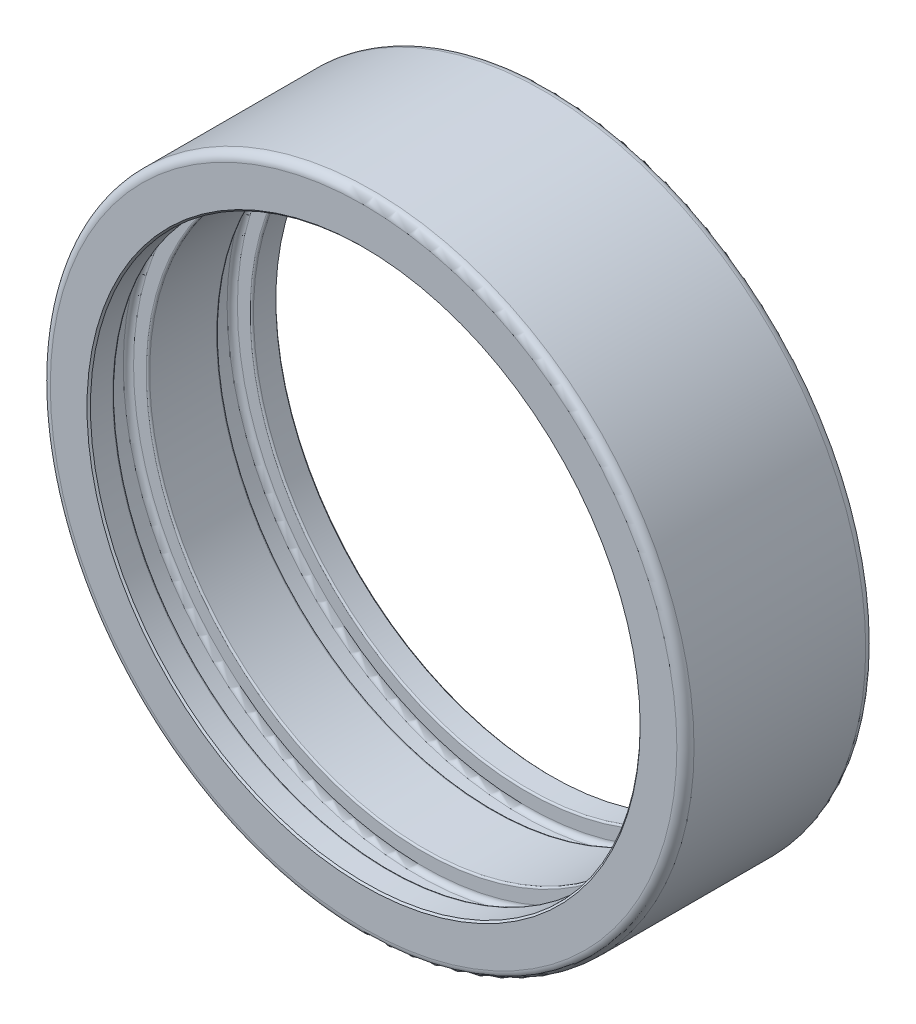
ISO-10303-21;
HEADER;
FILE_DESCRIPTION(('STEP AP214'),'2;1');
FILE_NAME('part.step','',(''),(''),'','','');
FILE_SCHEMA(('AUTOMOTIVE_DESIGN { 1 0 10303 214 1 1 1 1 }'));
ENDSEC;
DATA;
#1=APPLICATION_CONTEXT('core data for automotive mechanical design processes');
#2=APPLICATION_PROTOCOL_DEFINITION('international standard','automotive_design',2000,#1);
#3=PRODUCT_CONTEXT('',#1,'mechanical');
#4=PRODUCT('Part','Part','',(#3));
#5=PRODUCT_RELATED_PRODUCT_CATEGORY('part','',(#4));
#6=PRODUCT_DEFINITION_FORMATION('','',#4);
#7=PRODUCT_DEFINITION_CONTEXT('part definition',#1,'design');
#8=PRODUCT_DEFINITION('design','',#6,#7);
#9=PRODUCT_DEFINITION_SHAPE('','',#8);
#10=(LENGTH_UNIT() NAMED_UNIT(*) SI_UNIT(.MILLI.,.METRE.));
#11=(NAMED_UNIT(*) PLANE_ANGLE_UNIT() SI_UNIT($,.RADIAN.));
#12=(NAMED_UNIT(*) SI_UNIT($,.STERADIAN.) SOLID_ANGLE_UNIT());
#13=UNCERTAINTY_MEASURE_WITH_UNIT(LENGTH_MEASURE(1.E-05),#10,'distance_accuracy_value','');
#14=(GEOMETRIC_REPRESENTATION_CONTEXT(3) GLOBAL_UNCERTAINTY_ASSIGNED_CONTEXT((#13)) GLOBAL_UNIT_ASSIGNED_CONTEXT((#10,
#11,#12)) REPRESENTATION_CONTEXT('',''));
#15=CARTESIAN_POINT('',(0.,0.,0.));
#16=DIRECTION('',(0.,0.,1.));
#17=DIRECTION('',(1.,0.,0.));
#18=AXIS2_PLACEMENT_3D('',#15,#16,#17);
#19=CARTESIAN_POINT('',(0.,0.,22.));
#20=DIRECTION('',(0.,0.,-1.));
#21=DIRECTION('',(-1.,0.,0.));
#22=AXIS2_PLACEMENT_3D('',#19,#20,#21);
#23=CYLINDRICAL_SURFACE('',#22,32.025);
#24=CARTESIAN_POINT('',(0.,0.,0.200000000000013));
#25=DIRECTION('',(0.,0.,1.));
#26=DIRECTION('',(1.,0.,0.));
#27=AXIS2_PLACEMENT_3D('',#24,#25,#26);
#28=CIRCLE('',#27,32.025);
#29=CARTESIAN_POINT('',(32.025,0.,0.200000000000013));
#30=VERTEX_POINT('',#29);
#31=EDGE_CURVE('E44',#30,#30,#28,.F.);
#32=ORIENTED_EDGE('',*,*,#31,.T.);
#33=EDGE_LOOP('',(#32));
#34=FACE_BOUND('',#33,.T.);
#35=CARTESIAN_POINT('',(0.,0.,2.8));
#36=DIRECTION('',(0.,0.,1.));
#37=DIRECTION('',(1.,0.,0.));
#38=AXIS2_PLACEMENT_3D('',#35,#36,#37);
#39=CIRCLE('',#38,32.025);
#40=CARTESIAN_POINT('',(32.025,0.,2.8));
#41=VERTEX_POINT('',#40);
#42=EDGE_CURVE('E74',#41,#41,#39,.T.);
#43=ORIENTED_EDGE('',*,*,#42,.T.);
#44=EDGE_LOOP('',(#43));
#45=FACE_BOUND('',#44,.T.);
#46=ADVANCED_FACE('F33',(#34,#45),#23,.F.);
#47=CARTESIAN_POINT('',(0.,0.,7.1));
#48=DIRECTION('',(0.,0.,1.));
#49=DIRECTION('',(1.,0.,0.));
#50=AXIS2_PLACEMENT_3D('',#47,#48,#49);
#51=CIRCLE('',#50,32.025);
#52=CARTESIAN_POINT('',(32.025,0.,7.1));
#53=VERTEX_POINT('',#52);
#54=EDGE_CURVE('E62',#53,#53,#51,.F.);
#55=ORIENTED_EDGE('',*,*,#54,.T.);
#56=EDGE_LOOP('',(#55));
#57=FACE_BOUND('',#56,.T.);
#58=CARTESIAN_POINT('',(0.,0.,14.9));
#59=DIRECTION('',(0.,0.,1.));
#60=DIRECTION('',(1.,0.,0.));
#61=AXIS2_PLACEMENT_3D('',#58,#59,#60);
#62=CIRCLE('',#61,32.025);
#63=CARTESIAN_POINT('',(32.025,0.,14.9));
#64=VERTEX_POINT('',#63);
#65=EDGE_CURVE('E65',#64,#64,#62,.T.);
#66=ORIENTED_EDGE('',*,*,#65,.T.);
#67=EDGE_LOOP('',(#66));
#68=FACE_BOUND('',#67,.T.);
#69=ADVANCED_FACE('F132',(#57,#68),#23,.F.);
#70=CARTESIAN_POINT('',(0.,0.,22.));
#71=DIRECTION('',(0.,0.,1.));
#72=DIRECTION('',(1.,0.,0.));
#73=AXIS2_PLACEMENT_3D('',#70,#71,#72);
#74=PLANE('',#73);
#75=CARTESIAN_POINT('',(0.,0.,22.));
#76=DIRECTION('',(0.,0.,1.));
#77=DIRECTION('',(1.,0.,0.));
#78=AXIS2_PLACEMENT_3D('',#75,#76,#77);
#79=CIRCLE('',#78,32.225);
#80=CARTESIAN_POINT('',(32.225,0.,22.));
#81=VERTEX_POINT('',#80);
#82=EDGE_CURVE('E10',#81,#81,#79,.F.);
#83=ORIENTED_EDGE('',*,*,#82,.T.);
#84=EDGE_LOOP('',(#83));
#85=FACE_BOUND('',#84,.T.);
#86=CARTESIAN_POINT('',(0.,0.,22.));
#87=DIRECTION('',(0.,0.,1.));
#88=DIRECTION('',(1.,0.,0.));
#89=AXIS2_PLACEMENT_3D('',#86,#87,#88);
#90=CIRCLE('',#89,36.5);
#91=CARTESIAN_POINT('',(36.5,0.,22.));
#92=VERTEX_POINT('',#91);
#93=EDGE_CURVE('E77',#92,#92,#90,.T.);
#94=ORIENTED_EDGE('',*,*,#93,.T.);
#95=EDGE_LOOP('',(#94));
#96=FACE_BOUND('',#95,.T.);
#97=ADVANCED_FACE('F139',(#85,#96),#74,.T.);
#98=CARTESIAN_POINT('',(0.,0.,0.));
#99=DIRECTION('',(0.,0.,1.));
#100=DIRECTION('',(1.,0.,0.));
#101=AXIS2_PLACEMENT_3D('',#98,#99,#100);
#102=PLANE('',#101);
#103=CARTESIAN_POINT('',(0.,0.,0.));
#104=DIRECTION('',(0.,0.,1.));
#105=DIRECTION('',(1.,0.,0.));
#106=AXIS2_PLACEMENT_3D('',#103,#104,#105);
#107=CIRCLE('',#106,32.225);
#108=CARTESIAN_POINT('',(32.225,0.,0.));
#109=VERTEX_POINT('',#108);
#110=EDGE_CURVE('E48',#109,#109,#107,.T.);
#111=ORIENTED_EDGE('',*,*,#110,.T.);
#112=EDGE_LOOP('',(#111));
#113=FACE_BOUND('',#112,.T.);
#114=CARTESIAN_POINT('',(0.,0.,0.));
#115=DIRECTION('',(0.,0.,1.));
#116=DIRECTION('',(1.,0.,0.));
#117=AXIS2_PLACEMENT_3D('',#114,#115,#116);
#118=CIRCLE('',#117,36.5);
#119=CARTESIAN_POINT('',(36.5,0.,0.));
#120=VERTEX_POINT('',#119);
#121=EDGE_CURVE('E80',#120,#120,#118,.F.);
#122=ORIENTED_EDGE('',*,*,#121,.T.);
#123=EDGE_LOOP('',(#122));
#124=FACE_BOUND('',#123,.T.);
#125=ADVANCED_FACE('F154',(#113,#124),#102,.F.);
#126=CARTESIAN_POINT('',(0.,0.,22.));
#127=DIRECTION('',(0.,0.,-1.));
#128=DIRECTION('',(-1.,0.,0.));
#129=AXIS2_PLACEMENT_3D('',#126,#127,#128);
#130=CYLINDRICAL_SURFACE('',#129,37.5);
#131=CARTESIAN_POINT('',(0.,0.,1.));
#132=DIRECTION('',(0.,0.,1.));
#133=DIRECTION('',(1.,0.,0.));
#134=AXIS2_PLACEMENT_3D('',#131,#132,#133);
#135=CIRCLE('',#134,37.5);
#136=CARTESIAN_POINT('',(37.5,0.,1.));
#137=VERTEX_POINT('',#136);
#138=EDGE_CURVE('E83',#137,#137,#135,.T.);
#139=ORIENTED_EDGE('',*,*,#138,.T.);
#140=EDGE_LOOP('',(#139));
#141=FACE_BOUND('',#140,.T.);
#142=CARTESIAN_POINT('',(0.,0.,21.));
#143=DIRECTION('',(0.,0.,1.));
#144=DIRECTION('',(1.,0.,0.));
#145=AXIS2_PLACEMENT_3D('',#142,#143,#144);
#146=CIRCLE('',#145,37.5);
#147=CARTESIAN_POINT('',(37.5,0.,21.));
#148=VERTEX_POINT('',#147);
#149=EDGE_CURVE('E86',#148,#148,#146,.F.);
#150=ORIENTED_EDGE('',*,*,#149,.T.);
#151=EDGE_LOOP('',(#150));
#152=FACE_BOUND('',#151,.T.);
#153=ADVANCED_FACE('F146',(#141,#152),#130,.T.);
#154=CARTESIAN_POINT('',(0.,0.,21.8));
#155=DIRECTION('',(0.,0.,1.));
#156=DIRECTION('',(1.,0.,0.));
#157=AXIS2_PLACEMENT_3D('',#154,#155,#156);
#158=CIRCLE('',#157,32.025);
#159=CARTESIAN_POINT('',(32.025,0.,21.8));
#160=VERTEX_POINT('',#159);
#161=EDGE_CURVE('E40',#160,#160,#158,.T.);
#162=ORIENTED_EDGE('',*,*,#161,.T.);
#163=EDGE_LOOP('',(#162));
#164=FACE_BOUND('',#163,.T.);
#165=CARTESIAN_POINT('',(0.,0.,19.2));
#166=DIRECTION('',(0.,0.,1.));
#167=DIRECTION('',(1.,0.,0.));
#168=AXIS2_PLACEMENT_3D('',#165,#166,#167);
#169=CIRCLE('',#168,32.025);
#170=CARTESIAN_POINT('',(32.025,0.,19.2));
#171=VERTEX_POINT('',#170);
#172=EDGE_CURVE('E53',#171,#171,#169,.F.);
#173=ORIENTED_EDGE('',*,*,#172,.T.);
#174=EDGE_LOOP('',(#173));
#175=FACE_BOUND('',#174,.T.);
#176=ADVANCED_FACE('F135',(#164,#175),#23,.F.);
#177=CARTESIAN_POINT('',(0.,0.,1.));
#178=DIRECTION('',(0.,0.,1.));
#179=DIRECTION('',(1.,0.,0.));
#180=AXIS2_PLACEMENT_3D('',#177,#178,#179);
#181=TOROIDAL_SURFACE('',#180,36.5,1.);
#182=ORIENTED_EDGE('',*,*,#121,.F.);
#183=EDGE_LOOP('',(#182));
#184=FACE_BOUND('',#183,.T.);
#185=ORIENTED_EDGE('',*,*,#138,.F.);
#186=EDGE_LOOP('',(#185));
#187=FACE_BOUND('',#186,.T.);
#188=ADVANCED_FACE('F145',(#184,#187),#181,.T.);
#189=CARTESIAN_POINT('',(0.,0.,21.));
#190=DIRECTION('',(0.,0.,1.));
#191=DIRECTION('',(1.,0.,0.));
#192=AXIS2_PLACEMENT_3D('',#189,#190,#191);
#193=TOROIDAL_SURFACE('',#192,36.5,1.);
#194=ORIENTED_EDGE('',*,*,#149,.F.);
#195=EDGE_LOOP('',(#194));
#196=FACE_BOUND('',#195,.T.);
#197=ORIENTED_EDGE('',*,*,#93,.F.);
#198=EDGE_LOOP('',(#197));
#199=FACE_BOUND('',#198,.T.);
#200=ADVANCED_FACE('F151',(#196,#199),#193,.T.);
#201=CARTESIAN_POINT('',(0.,0.,18.4));
#202=DIRECTION('',(0.,0.,-1.));
#203=DIRECTION('',(-1.,0.,0.));
#204=AXIS2_PLACEMENT_3D('',#201,#202,#203);
#205=TOROIDAL_SURFACE('',#204,33.7,0.6);
#206=CARTESIAN_POINT('',(0.,0.,18.4));
#207=DIRECTION('',(0.,0.,-1.));
#208=DIRECTION('',(-1.,0.,0.));
#209=AXIS2_PLACEMENT_3D('',#206,#207,#208);
#210=CIRCLE('',#209,34.3);
#211=CARTESIAN_POINT('',(-34.3,0.,18.4));
#212=VERTEX_POINT('',#211);
#213=EDGE_CURVE('E89',#212,#212,#210,.T.);
#214=ORIENTED_EDGE('',*,*,#213,.T.);
#215=EDGE_LOOP('',(#214));
#216=FACE_BOUND('',#215,.T.);
#217=CARTESIAN_POINT('',(0.,0.,19.));
#218=DIRECTION('',(0.,0.,-1.));
#219=DIRECTION('',(-1.,0.,0.));
#220=AXIS2_PLACEMENT_3D('',#217,#218,#219);
#221=CIRCLE('',#220,33.7);
#222=CARTESIAN_POINT('',(-33.7,0.,19.));
#223=VERTEX_POINT('',#222);
#224=EDGE_CURVE('E98',#223,#223,#221,.T.);
#225=ORIENTED_EDGE('',*,*,#224,.F.);
#226=EDGE_LOOP('',(#225));
#227=FACE_BOUND('',#226,.T.);
#228=ADVANCED_FACE('F174',(#216,#227),#205,.F.);
#229=CARTESIAN_POINT('',(0.,0.,0.));
#230=DIRECTION('',(0.,0.,-1.));
#231=DIRECTION('',(-1.,0.,0.));
#232=AXIS2_PLACEMENT_3D('',#229,#230,#231);
#233=CYLINDRICAL_SURFACE('',#232,34.3);
#234=CARTESIAN_POINT('',(0.,0.,15.7));
#235=DIRECTION('',(0.,0.,-1.));
#236=DIRECTION('',(-1.,0.,0.));
#237=AXIS2_PLACEMENT_3D('',#234,#235,#236);
#238=CIRCLE('',#237,34.3);
#239=CARTESIAN_POINT('',(-34.3,0.,15.7));
#240=VERTEX_POINT('',#239);
#241=EDGE_CURVE('E92',#240,#240,#238,.T.);
#242=ORIENTED_EDGE('',*,*,#241,.T.);
#243=EDGE_LOOP('',(#242));
#244=FACE_BOUND('',#243,.T.);
#245=ORIENTED_EDGE('',*,*,#213,.F.);
#246=EDGE_LOOP('',(#245));
#247=FACE_BOUND('',#246,.T.);
#248=ADVANCED_FACE('F176',(#244,#247),#233,.F.);
#249=CARTESIAN_POINT('',(0.,0.,15.7));
#250=DIRECTION('',(0.,0.,-1.));
#251=DIRECTION('',(-1.,0.,0.));
#252=AXIS2_PLACEMENT_3D('',#249,#250,#251);
#253=TOROIDAL_SURFACE('',#252,33.7,0.600000000000002);
#254=ORIENTED_EDGE('',*,*,#241,.F.);
#255=EDGE_LOOP('',(#254));
#256=FACE_BOUND('',#255,.T.);
#257=CARTESIAN_POINT('',(0.,0.,15.1));
#258=DIRECTION('',(0.,0.,-1.));
#259=DIRECTION('',(-1.,0.,0.));
#260=AXIS2_PLACEMENT_3D('',#257,#258,#259);
#261=CIRCLE('',#260,33.7);
#262=CARTESIAN_POINT('',(-33.7,0.,15.1));
#263=VERTEX_POINT('',#262);
#264=EDGE_CURVE('E95',#263,#263,#261,.T.);
#265=ORIENTED_EDGE('',*,*,#264,.T.);
#266=EDGE_LOOP('',(#265));
#267=FACE_BOUND('',#266,.T.);
#268=ADVANCED_FACE('F182',(#256,#267),#253,.F.);
#269=CARTESIAN_POINT('',(0.,33.7,15.1));
#270=DIRECTION('',(0.,0.,1.));
#271=DIRECTION('',(1.,0.,0.));
#272=AXIS2_PLACEMENT_3D('',#269,#270,#271);
#273=PLANE('',#272);
#274=CARTESIAN_POINT('',(0.,0.,15.1));
#275=DIRECTION('',(0.,0.,1.));
#276=DIRECTION('',(1.,0.,0.));
#277=AXIS2_PLACEMENT_3D('',#274,#275,#276);
#278=CIRCLE('',#277,32.225);
#279=CARTESIAN_POINT('',(32.225,0.,15.1));
#280=VERTEX_POINT('',#279);
#281=EDGE_CURVE('E59',#280,#280,#278,.F.);
#282=ORIENTED_EDGE('',*,*,#281,.T.);
#283=EDGE_LOOP('',(#282));
#284=FACE_BOUND('',#283,.T.);
#285=ORIENTED_EDGE('',*,*,#264,.F.);
#286=EDGE_LOOP('',(#285));
#287=FACE_BOUND('',#286,.T.);
#288=ADVANCED_FACE('F170',(#284,#287),#273,.T.);
#289=CARTESIAN_POINT('',(0.,33.7,19.));
#290=DIRECTION('',(0.,0.,1.));
#291=DIRECTION('',(1.,0.,0.));
#292=AXIS2_PLACEMENT_3D('',#289,#290,#291);
#293=PLANE('',#292);
#294=CARTESIAN_POINT('',(0.,0.,19.));
#295=DIRECTION('',(0.,0.,1.));
#296=DIRECTION('',(1.,0.,0.));
#297=AXIS2_PLACEMENT_3D('',#294,#295,#296);
#298=CIRCLE('',#297,32.225);
#299=CARTESIAN_POINT('',(32.225,0.,19.));
#300=VERTEX_POINT('',#299);
#301=EDGE_CURVE('E56',#300,#300,#298,.T.);
#302=ORIENTED_EDGE('',*,*,#301,.T.);
#303=EDGE_LOOP('',(#302));
#304=FACE_BOUND('',#303,.T.);
#305=ORIENTED_EDGE('',*,*,#224,.T.);
#306=EDGE_LOOP('',(#305));
#307=FACE_BOUND('',#306,.T.);
#308=ADVANCED_FACE('F129',(#304,#307),#293,.F.);
#309=CARTESIAN_POINT('',(0.,0.,6.29999999999999));
#310=DIRECTION('',(0.,0.,-1.));
#311=DIRECTION('',(-1.,0.,0.));
#312=AXIS2_PLACEMENT_3D('',#309,#310,#311);
#313=TOROIDAL_SURFACE('',#312,33.7,0.600000000000002);
#314=CARTESIAN_POINT('',(0.,0.,6.29999999999999));
#315=DIRECTION('',(0.,0.,-1.));
#316=DIRECTION('',(-1.,0.,0.));
#317=AXIS2_PLACEMENT_3D('',#314,#315,#316);
#318=CIRCLE('',#317,34.3);
#319=CARTESIAN_POINT('',(-34.3,0.,6.29999999999999));
#320=VERTEX_POINT('',#319);
#321=EDGE_CURVE('E110',#320,#320,#318,.T.);
#322=ORIENTED_EDGE('',*,*,#321,.T.);
#323=EDGE_LOOP('',(#322));
#324=FACE_BOUND('',#323,.T.);
#325=CARTESIAN_POINT('',(0.,0.,6.89999999999999));
#326=DIRECTION('',(0.,0.,-1.));
#327=DIRECTION('',(-1.,0.,0.));
#328=AXIS2_PLACEMENT_3D('',#325,#326,#327);
#329=CIRCLE('',#328,33.7);
#330=CARTESIAN_POINT('',(-33.7,0.,6.89999999999999));
#331=VERTEX_POINT('',#330);
#332=EDGE_CURVE('E101',#331,#331,#329,.T.);
#333=ORIENTED_EDGE('',*,*,#332,.F.);
#334=EDGE_LOOP('',(#333));
#335=FACE_BOUND('',#334,.T.);
#336=ADVANCED_FACE('F114',(#324,#335),#313,.F.);
#337=CARTESIAN_POINT('',(0.,0.,0.));
#338=DIRECTION('',(0.,0.,-1.));
#339=DIRECTION('',(-1.,0.,0.));
#340=AXIS2_PLACEMENT_3D('',#337,#338,#339);
#341=CYLINDRICAL_SURFACE('',#340,34.3);
#342=CARTESIAN_POINT('',(0.,0.,3.6));
#343=DIRECTION('',(0.,0.,-1.));
#344=DIRECTION('',(-1.,0.,0.));
#345=AXIS2_PLACEMENT_3D('',#342,#343,#344);
#346=CIRCLE('',#345,34.3);
#347=CARTESIAN_POINT('',(-34.3,0.,3.6));
#348=VERTEX_POINT('',#347);
#349=EDGE_CURVE('E107',#348,#348,#346,.T.);
#350=ORIENTED_EDGE('',*,*,#349,.T.);
#351=EDGE_LOOP('',(#350));
#352=FACE_BOUND('',#351,.T.);
#353=ORIENTED_EDGE('',*,*,#321,.F.);
#354=EDGE_LOOP('',(#353));
#355=FACE_BOUND('',#354,.T.);
#356=ADVANCED_FACE('F117',(#352,#355),#341,.F.);
#357=CARTESIAN_POINT('',(0.,0.,3.6));
#358=DIRECTION('',(0.,0.,-1.));
#359=DIRECTION('',(-1.,0.,0.));
#360=AXIS2_PLACEMENT_3D('',#357,#358,#359);
#361=TOROIDAL_SURFACE('',#360,33.7,0.600000000000001);
#362=ORIENTED_EDGE('',*,*,#349,.F.);
#363=EDGE_LOOP('',(#362));
#364=FACE_BOUND('',#363,.T.);
#365=CARTESIAN_POINT('',(0.,0.,3.));
#366=DIRECTION('',(0.,0.,-1.));
#367=DIRECTION('',(-1.,0.,0.));
#368=AXIS2_PLACEMENT_3D('',#365,#366,#367);
#369=CIRCLE('',#368,33.7);
#370=CARTESIAN_POINT('',(-33.7,0.,3.));
#371=VERTEX_POINT('',#370);
#372=EDGE_CURVE('E104',#371,#371,#369,.T.);
#373=ORIENTED_EDGE('',*,*,#372,.T.);
#374=EDGE_LOOP('',(#373));
#375=FACE_BOUND('',#374,.T.);
#376=ADVANCED_FACE('F119',(#364,#375),#361,.F.);
#377=CARTESIAN_POINT('',(0.,33.7,3.));
#378=DIRECTION('',(0.,0.,1.));
#379=DIRECTION('',(1.,0.,0.));
#380=AXIS2_PLACEMENT_3D('',#377,#378,#379);
#381=PLANE('',#380);
#382=CARTESIAN_POINT('',(0.,0.,3.));
#383=DIRECTION('',(0.,0.,1.));
#384=DIRECTION('',(1.,0.,0.));
#385=AXIS2_PLACEMENT_3D('',#382,#383,#384);
#386=CIRCLE('',#385,32.225);
#387=CARTESIAN_POINT('',(32.225,0.,3.));
#388=VERTEX_POINT('',#387);
#389=EDGE_CURVE('E71',#388,#388,#386,.F.);
#390=ORIENTED_EDGE('',*,*,#389,.T.);
#391=EDGE_LOOP('',(#390));
#392=FACE_BOUND('',#391,.T.);
#393=ORIENTED_EDGE('',*,*,#372,.F.);
#394=EDGE_LOOP('',(#393));
#395=FACE_BOUND('',#394,.T.);
#396=ADVANCED_FACE('F126',(#392,#395),#381,.T.);
#397=CARTESIAN_POINT('',(0.,33.7,6.9));
#398=DIRECTION('',(0.,0.,1.));
#399=DIRECTION('',(1.,0.,0.));
#400=AXIS2_PLACEMENT_3D('',#397,#398,#399);
#401=PLANE('',#400);
#402=CARTESIAN_POINT('',(0.,0.,6.9));
#403=DIRECTION('',(0.,0.,1.));
#404=DIRECTION('',(1.,0.,0.));
#405=AXIS2_PLACEMENT_3D('',#402,#403,#404);
#406=CIRCLE('',#405,32.225);
#407=CARTESIAN_POINT('',(32.225,0.,6.9));
#408=VERTEX_POINT('',#407);
#409=EDGE_CURVE('E68',#408,#408,#406,.T.);
#410=ORIENTED_EDGE('',*,*,#409,.T.);
#411=EDGE_LOOP('',(#410));
#412=FACE_BOUND('',#411,.T.);
#413=ORIENTED_EDGE('',*,*,#332,.T.);
#414=EDGE_LOOP('',(#413));
#415=FACE_BOUND('',#414,.T.);
#416=ADVANCED_FACE('F194',(#412,#415),#401,.F.);
#417=CARTESIAN_POINT('',(0.,0.,2.8));
#418=DIRECTION('',(0.,0.,1.));
#419=DIRECTION('',(1.,0.,0.));
#420=AXIS2_PLACEMENT_3D('',#417,#418,#419);
#421=TOROIDAL_SURFACE('',#420,32.225,0.2);
#422=ORIENTED_EDGE('',*,*,#389,.F.);
#423=EDGE_LOOP('',(#422));
#424=FACE_BOUND('',#423,.T.);
#425=ORIENTED_EDGE('',*,*,#42,.F.);
#426=EDGE_LOOP('',(#425));
#427=FACE_BOUND('',#426,.T.);
#428=ADVANCED_FACE('F197',(#424,#427),#421,.T.);
#429=CARTESIAN_POINT('',(0.,0.,7.1));
#430=DIRECTION('',(0.,0.,1.));
#431=DIRECTION('',(1.,0.,0.));
#432=AXIS2_PLACEMENT_3D('',#429,#430,#431);
#433=TOROIDAL_SURFACE('',#432,32.225,0.2);
#434=ORIENTED_EDGE('',*,*,#54,.F.);
#435=EDGE_LOOP('',(#434));
#436=FACE_BOUND('',#435,.T.);
#437=ORIENTED_EDGE('',*,*,#409,.F.);
#438=EDGE_LOOP('',(#437));
#439=FACE_BOUND('',#438,.T.);
#440=ADVANCED_FACE('F210',(#436,#439),#433,.T.);
#441=CARTESIAN_POINT('',(0.,0.,14.9));
#442=DIRECTION('',(0.,0.,1.));
#443=DIRECTION('',(1.,0.,0.));
#444=AXIS2_PLACEMENT_3D('',#441,#442,#443);
#445=TOROIDAL_SURFACE('',#444,32.225,0.2);
#446=ORIENTED_EDGE('',*,*,#281,.F.);
#447=EDGE_LOOP('',(#446));
#448=FACE_BOUND('',#447,.T.);
#449=ORIENTED_EDGE('',*,*,#65,.F.);
#450=EDGE_LOOP('',(#449));
#451=FACE_BOUND('',#450,.T.);
#452=ADVANCED_FACE('F164',(#448,#451),#445,.T.);
#453=CARTESIAN_POINT('',(0.,0.,19.2));
#454=DIRECTION('',(0.,0.,1.));
#455=DIRECTION('',(1.,0.,0.));
#456=AXIS2_PLACEMENT_3D('',#453,#454,#455);
#457=TOROIDAL_SURFACE('',#456,32.225,0.2);
#458=ORIENTED_EDGE('',*,*,#172,.F.);
#459=EDGE_LOOP('',(#458));
#460=FACE_BOUND('',#459,.T.);
#461=ORIENTED_EDGE('',*,*,#301,.F.);
#462=EDGE_LOOP('',(#461));
#463=FACE_BOUND('',#462,.T.);
#464=ADVANCED_FACE('F160',(#460,#463),#457,.T.);
#465=CARTESIAN_POINT('',(0.,0.,0.));
#466=DIRECTION('',(0.,0.,-1.));
#467=DIRECTION('',(-1.,0.,0.));
#468=AXIS2_PLACEMENT_3D('',#465,#466,#467);
#469=CONICAL_SURFACE('',#468,32.225,0.785398163397448);
#470=ORIENTED_EDGE('',*,*,#31,.F.);
#471=EDGE_LOOP('',(#470));
#472=FACE_BOUND('',#471,.T.);
#473=ORIENTED_EDGE('',*,*,#110,.F.);
#474=EDGE_LOOP('',(#473));
#475=FACE_BOUND('',#474,.T.);
#476=ADVANCED_FACE('F163',(#472,#475),#469,.F.);
#477=CARTESIAN_POINT('',(0.,0.,21.8));
#478=DIRECTION('',(0.,0.,1.));
#479=DIRECTION('',(1.,0.,0.));
#480=AXIS2_PLACEMENT_3D('',#477,#478,#479);
#481=CONICAL_SURFACE('',#480,32.025,0.785398163397448);
#482=ORIENTED_EDGE('',*,*,#82,.F.);
#483=EDGE_LOOP('',(#482));
#484=FACE_BOUND('',#483,.T.);
#485=ORIENTED_EDGE('',*,*,#161,.F.);
#486=EDGE_LOOP('',(#485));
#487=FACE_BOUND('',#486,.T.);
#488=ADVANCED_FACE('F35',(#484,#487),#481,.F.);
#489=CLOSED_SHELL('',(#46,#69,#97,#125,#153,#176,#188,#200,#228,#248,#268,#288,#308,#336,#356,
#376,#396,#416,#428,#440,#452,#464,#476,#488));
#490=MANIFOLD_SOLID_BREP('B2',#489);
#491=ADVANCED_BREP_SHAPE_REPRESENTATION('',(#18,#490),#14);
#492=SHAPE_DEFINITION_REPRESENTATION(#9,#491);
ENDSEC;
END-ISO-10303-21;
